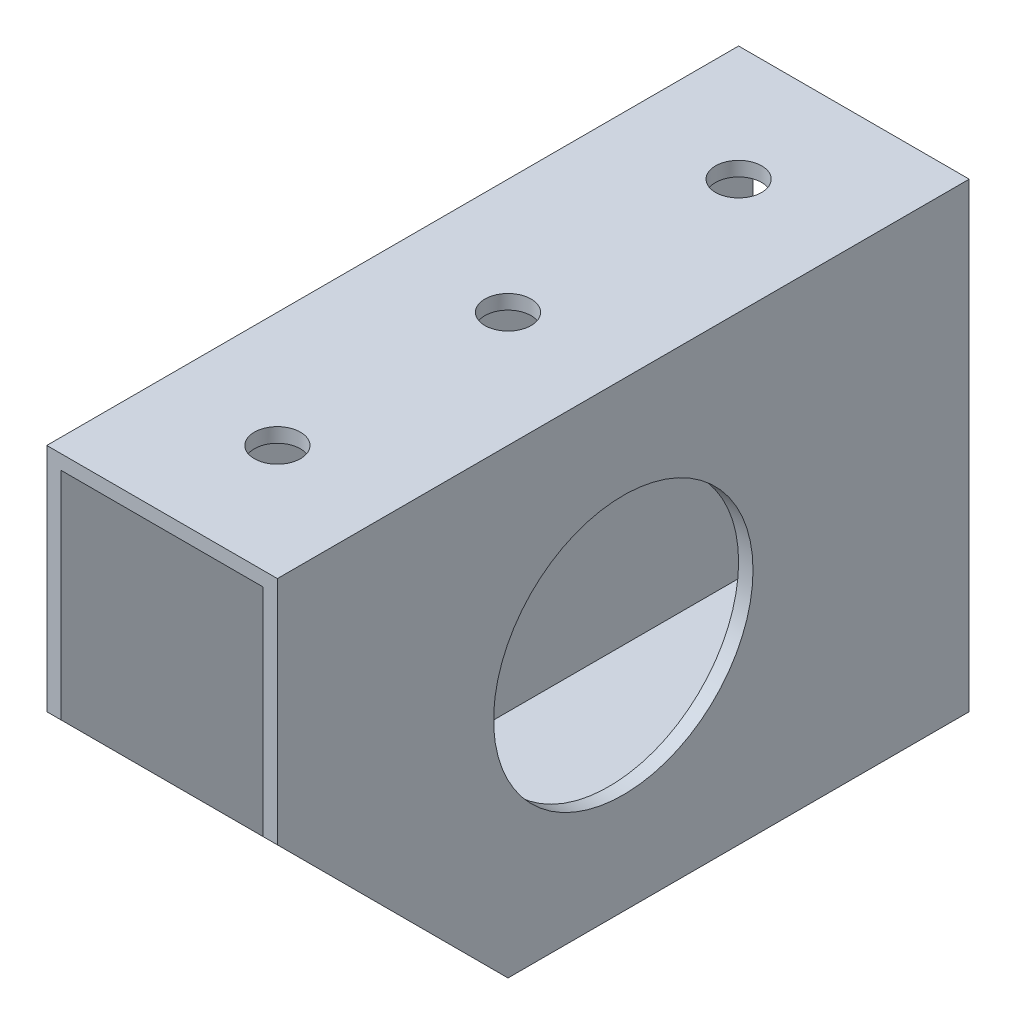
ISO-10303-21;
HEADER;
FILE_DESCRIPTION(('STEP AP214'),'2;1');
FILE_NAME('part.step','',(''),(''),'','','');
FILE_SCHEMA(('AUTOMOTIVE_DESIGN { 1 0 10303 214 1 1 1 1 }'));
ENDSEC;
DATA;
#1=APPLICATION_CONTEXT('core data for automotive mechanical design processes');
#2=APPLICATION_PROTOCOL_DEFINITION('international standard','automotive_design',2000,#1);
#3=PRODUCT_CONTEXT('',#1,'mechanical');
#4=PRODUCT('Part','Part','',(#3));
#5=PRODUCT_RELATED_PRODUCT_CATEGORY('part','',(#4));
#6=PRODUCT_DEFINITION_FORMATION('','',#4);
#7=PRODUCT_DEFINITION_CONTEXT('part definition',#1,'design');
#8=PRODUCT_DEFINITION('design','',#6,#7);
#9=PRODUCT_DEFINITION_SHAPE('','',#8);
#10=(LENGTH_UNIT() NAMED_UNIT(*) SI_UNIT(.MILLI.,.METRE.));
#11=(NAMED_UNIT(*) PLANE_ANGLE_UNIT() SI_UNIT($,.RADIAN.));
#12=(NAMED_UNIT(*) SI_UNIT($,.STERADIAN.) SOLID_ANGLE_UNIT());
#13=UNCERTAINTY_MEASURE_WITH_UNIT(LENGTH_MEASURE(1.E-05),#10,'distance_accuracy_value','');
#14=(GEOMETRIC_REPRESENTATION_CONTEXT(3) GLOBAL_UNCERTAINTY_ASSIGNED_CONTEXT((#13)) GLOBAL_UNIT_ASSIGNED_CONTEXT((#10,
#11,#12)) REPRESENTATION_CONTEXT('',''));
#15=CARTESIAN_POINT('',(0.,0.,0.));
#16=DIRECTION('',(0.,0.,1.));
#17=DIRECTION('',(1.,0.,0.));
#18=AXIS2_PLACEMENT_3D('',#15,#16,#17);
#19=CARTESIAN_POINT('',(0.,0.,76.2));
#20=DIRECTION('',(0.,0.,-1.));
#21=DIRECTION('',(-1.,0.,0.));
#22=AXIS2_PLACEMENT_3D('',#19,#20,#21);
#23=PLANE('',#22);
#24=DIRECTION('',(0.,-1.,0.));
#25=VECTOR('',#24,1.);
#26=CARTESIAN_POINT('',(0.,0.,76.2));
#27=LINE('',#26,#25);
#28=CARTESIAN_POINT('',(0.,50.8,76.2));
#29=VERTEX_POINT('',#28);
#30=CARTESIAN_POINT('',(0.,25.4,76.2));
#31=VERTEX_POINT('',#30);
#32=EDGE_CURVE('E207',#29,#31,#27,.T.);
#33=ORIENTED_EDGE('',*,*,#32,.T.);
#34=DIRECTION('',(1.,0.,0.));
#35=VECTOR('',#34,1.);
#36=CARTESIAN_POINT('',(0.,25.4,76.2));
#37=LINE('',#36,#35);
#38=CARTESIAN_POINT('',(1.5875,25.4,76.2));
#39=VERTEX_POINT('',#38);
#40=EDGE_CURVE('E120',#31,#39,#37,.T.);
#41=ORIENTED_EDGE('',*,*,#40,.T.);
#42=DIRECTION('',(0.,-1.,0.));
#43=VECTOR('',#42,1.);
#44=CARTESIAN_POINT('',(1.5875,1.5875,76.2));
#45=LINE('',#44,#43);
#46=CARTESIAN_POINT('',(1.5875,49.2125,76.2));
#47=VERTEX_POINT('',#46);
#48=EDGE_CURVE('E170',#47,#39,#45,.T.);
#49=ORIENTED_EDGE('',*,*,#48,.F.);
#50=DIRECTION('',(-1.,0.,0.));
#51=VECTOR('',#50,1.);
#52=CARTESIAN_POINT('',(1.5875,49.2125,76.2));
#53=LINE('',#52,#51);
#54=CARTESIAN_POINT('',(23.8125,49.2125,76.2));
#55=VERTEX_POINT('',#54);
#56=EDGE_CURVE('E177',#55,#47,#53,.T.);
#57=ORIENTED_EDGE('',*,*,#56,.F.);
#58=DIRECTION('',(0.,1.,0.));
#59=VECTOR('',#58,1.);
#60=CARTESIAN_POINT('',(23.8125,1.5875,76.2));
#61=LINE('',#60,#59);
#62=CARTESIAN_POINT('',(23.8125,25.4,76.2));
#63=VERTEX_POINT('',#62);
#64=EDGE_CURVE('E61',#63,#55,#61,.T.);
#65=ORIENTED_EDGE('',*,*,#64,.F.);
#66=CARTESIAN_POINT('',(25.4,25.4,76.2));
#67=VERTEX_POINT('',#66);
#68=EDGE_CURVE('E54',#63,#67,#37,.T.);
#69=ORIENTED_EDGE('',*,*,#68,.T.);
#70=DIRECTION('',(0.,1.,0.));
#71=VECTOR('',#70,1.);
#72=CARTESIAN_POINT('',(25.4,0.,76.2));
#73=LINE('',#72,#71);
#74=CARTESIAN_POINT('',(25.4,50.8,76.2));
#75=VERTEX_POINT('',#74);
#76=EDGE_CURVE('E210',#67,#75,#73,.T.);
#77=ORIENTED_EDGE('',*,*,#76,.T.);
#78=DIRECTION('',(-1.,0.,0.));
#79=VECTOR('',#78,1.);
#80=CARTESIAN_POINT('',(0.,50.8,76.2));
#81=LINE('',#80,#79);
#82=EDGE_CURVE('E214',#75,#29,#81,.T.);
#83=ORIENTED_EDGE('',*,*,#82,.T.);
#84=EDGE_LOOP('',(#33,#41,#49,#57,#65,#69,#77,#83));
#85=FACE_BOUND('',#84,.T.);
#86=ADVANCED_FACE('F39',(#85),#23,.F.);
#87=CARTESIAN_POINT('',(0.,0.,0.));
#88=DIRECTION('',(0.,0.,-1.));
#89=DIRECTION('',(-1.,0.,0.));
#90=AXIS2_PLACEMENT_3D('',#87,#88,#89);
#91=PLANE('',#90);
#92=DIRECTION('',(0.,-1.,0.));
#93=VECTOR('',#92,1.);
#94=CARTESIAN_POINT('',(0.,0.,0.));
#95=LINE('',#94,#93);
#96=CARTESIAN_POINT('',(0.,50.8,0.));
#97=VERTEX_POINT('',#96);
#98=CARTESIAN_POINT('',(0.,0.,0.));
#99=VERTEX_POINT('',#98);
#100=EDGE_CURVE('E139',#97,#99,#95,.T.);
#101=ORIENTED_EDGE('',*,*,#100,.F.);
#102=DIRECTION('',(-1.,0.,0.));
#103=VECTOR('',#102,1.);
#104=CARTESIAN_POINT('',(0.,50.8,0.));
#105=LINE('',#104,#103);
#106=CARTESIAN_POINT('',(25.4,50.8,0.));
#107=VERTEX_POINT('',#106);
#108=EDGE_CURVE('E211',#107,#97,#105,.T.);
#109=ORIENTED_EDGE('',*,*,#108,.F.);
#110=DIRECTION('',(0.,1.,0.));
#111=VECTOR('',#110,1.);
#112=CARTESIAN_POINT('',(25.4,0.,0.));
#113=LINE('',#112,#111);
#114=CARTESIAN_POINT('',(25.4,0.,0.));
#115=VERTEX_POINT('',#114);
#116=EDGE_CURVE('E223',#115,#107,#113,.T.);
#117=ORIENTED_EDGE('',*,*,#116,.F.);
#118=DIRECTION('',(1.,0.,0.));
#119=VECTOR('',#118,1.);
#120=CARTESIAN_POINT('',(0.,0.,0.));
#121=LINE('',#120,#119);
#122=EDGE_CURVE('E220',#99,#115,#121,.T.);
#123=ORIENTED_EDGE('',*,*,#122,.F.);
#124=EDGE_LOOP('',(#101,#109,#117,#123));
#125=FACE_BOUND('',#124,.T.);
#126=DIRECTION('',(-1.,0.,0.));
#127=VECTOR('',#126,1.);
#128=CARTESIAN_POINT('',(1.5875,49.2125,0.));
#129=LINE('',#128,#127);
#130=CARTESIAN_POINT('',(23.8125,49.2125,0.));
#131=VERTEX_POINT('',#130);
#132=CARTESIAN_POINT('',(1.5875,49.2125,0.));
#133=VERTEX_POINT('',#132);
#134=EDGE_CURVE('E174',#131,#133,#129,.T.);
#135=ORIENTED_EDGE('',*,*,#134,.T.);
#136=DIRECTION('',(0.,-1.,0.));
#137=VECTOR('',#136,1.);
#138=CARTESIAN_POINT('',(1.5875,1.5875,0.));
#139=LINE('',#138,#137);
#140=CARTESIAN_POINT('',(1.5875,1.5875,0.));
#141=VERTEX_POINT('',#140);
#142=EDGE_CURVE('E156',#133,#141,#139,.T.);
#143=ORIENTED_EDGE('',*,*,#142,.T.);
#144=DIRECTION('',(1.,0.,0.));
#145=VECTOR('',#144,1.);
#146=CARTESIAN_POINT('',(1.5875,1.5875,0.));
#147=LINE('',#146,#145);
#148=CARTESIAN_POINT('',(23.8125,1.5875,0.));
#149=VERTEX_POINT('',#148);
#150=EDGE_CURVE('E184',#141,#149,#147,.T.);
#151=ORIENTED_EDGE('',*,*,#150,.T.);
#152=DIRECTION('',(0.,1.,0.));
#153=VECTOR('',#152,1.);
#154=CARTESIAN_POINT('',(23.8125,1.5875,0.));
#155=LINE('',#154,#153);
#156=EDGE_CURVE('E188',#149,#131,#155,.T.);
#157=ORIENTED_EDGE('',*,*,#156,.T.);
#158=EDGE_LOOP('',(#135,#143,#151,#157));
#159=FACE_BOUND('',#158,.T.);
#160=ADVANCED_FACE('F241',(#125,#159),#91,.T.);
#161=CARTESIAN_POINT('',(0.,0.,76.2));
#162=DIRECTION('',(1.,0.,0.));
#163=DIRECTION('',(0.,0.,-1.));
#164=AXIS2_PLACEMENT_3D('',#161,#162,#163);
#165=PLANE('',#164);
#166=CARTESIAN_POINT('',(0.,25.4,38.1));
#167=DIRECTION('',(1.,0.,0.));
#168=DIRECTION('',(0.,0.,-1.));
#169=AXIS2_PLACEMENT_3D('',#166,#167,#168);
#170=CIRCLE('',#169,14.2875);
#171=CARTESIAN_POINT('',(0.,25.4,23.8125));
#172=VERTEX_POINT('',#171);
#173=EDGE_CURVE('E150',#172,#172,#170,.T.);
#174=ORIENTED_EDGE('',*,*,#173,.T.);
#175=EDGE_LOOP('',(#174));
#176=FACE_BOUND('',#175,.T.);
#177=DIRECTION('',(0.,0.,-1.));
#178=VECTOR('',#177,1.);
#179=CARTESIAN_POINT('',(0.,0.,76.2));
#180=LINE('',#179,#178);
#181=CARTESIAN_POINT('',(0.,0.,50.8));
#182=VERTEX_POINT('',#181);
#183=EDGE_CURVE('E48',#182,#99,#180,.T.);
#184=ORIENTED_EDGE('',*,*,#183,.F.);
#185=DIRECTION('',(0.,0.707106781186547,0.707106781186547));
#186=VECTOR('',#185,1.);
#187=CARTESIAN_POINT('',(0.,0.,50.8));
#188=LINE('',#187,#186);
#189=EDGE_CURVE('E114',#182,#31,#188,.T.);
#190=ORIENTED_EDGE('',*,*,#189,.T.);
#191=ORIENTED_EDGE('',*,*,#32,.F.);
#192=DIRECTION('',(0.,0.,-1.));
#193=VECTOR('',#192,1.);
#194=CARTESIAN_POINT('',(0.,50.8,76.2));
#195=LINE('',#194,#193);
#196=EDGE_CURVE('E217',#29,#97,#195,.T.);
#197=ORIENTED_EDGE('',*,*,#196,.T.);
#198=ORIENTED_EDGE('',*,*,#100,.T.);
#199=EDGE_LOOP('',(#184,#190,#191,#197,#198));
#200=FACE_BOUND('',#199,.T.);
#201=ADVANCED_FACE('F41',(#176,#200),#165,.F.);
#202=CARTESIAN_POINT('',(0.,0.,76.2));
#203=DIRECTION('',(0.,1.,0.));
#204=DIRECTION('',(0.,0.,1.));
#205=AXIS2_PLACEMENT_3D('',#202,#203,#204);
#206=PLANE('',#205);
#207=CARTESIAN_POINT('',(12.7,0.,12.7));
#208=DIRECTION('',(0.,-1.,0.));
#209=DIRECTION('',(0.,0.,-1.));
#210=AXIS2_PLACEMENT_3D('',#207,#208,#209);
#211=CIRCLE('',#210,2.54);
#212=CARTESIAN_POINT('',(12.7,0.,10.16));
#213=VERTEX_POINT('',#212);
#214=EDGE_CURVE('E309',#213,#213,#211,.T.);
#215=ORIENTED_EDGE('',*,*,#214,.F.);
#216=EDGE_LOOP('',(#215));
#217=FACE_BOUND('',#216,.T.);
#218=CARTESIAN_POINT('',(12.7,0.,39.6875));
#219=DIRECTION('',(0.,-1.,0.));
#220=DIRECTION('',(0.,0.,-1.));
#221=AXIS2_PLACEMENT_3D('',#218,#219,#220);
#222=CIRCLE('',#221,2.54);
#223=CARTESIAN_POINT('',(12.7,0.,37.1475));
#224=VERTEX_POINT('',#223);
#225=EDGE_CURVE('E312',#224,#224,#222,.T.);
#226=ORIENTED_EDGE('',*,*,#225,.F.);
#227=EDGE_LOOP('',(#226));
#228=FACE_BOUND('',#227,.T.);
#229=DIRECTION('',(0.,0.,-1.));
#230=VECTOR('',#229,1.);
#231=CARTESIAN_POINT('',(25.4,0.,76.2));
#232=LINE('',#231,#230);
#233=CARTESIAN_POINT('',(25.4,0.,50.8));
#234=VERTEX_POINT('',#233);
#235=EDGE_CURVE('E133',#234,#115,#232,.T.);
#236=ORIENTED_EDGE('',*,*,#235,.F.);
#237=DIRECTION('',(1.,0.,0.));
#238=VECTOR('',#237,1.);
#239=CARTESIAN_POINT('',(0.,0.,50.8));
#240=LINE('',#239,#238);
#241=EDGE_CURVE('E117',#182,#234,#240,.T.);
#242=ORIENTED_EDGE('',*,*,#241,.F.);
#243=ORIENTED_EDGE('',*,*,#183,.T.);
#244=ORIENTED_EDGE('',*,*,#122,.T.);
#245=EDGE_LOOP('',(#236,#242,#243,#244));
#246=FACE_BOUND('',#245,.T.);
#247=ADVANCED_FACE('F130',(#217,#228,#246),#206,.F.);
#248=CARTESIAN_POINT('',(25.4,0.,76.2));
#249=DIRECTION('',(-1.,0.,0.));
#250=DIRECTION('',(0.,0.,1.));
#251=AXIS2_PLACEMENT_3D('',#248,#249,#250);
#252=PLANE('',#251);
#253=CARTESIAN_POINT('',(25.4,25.4,38.1));
#254=DIRECTION('',(1.,0.,0.));
#255=DIRECTION('',(0.,0.,-1.));
#256=AXIS2_PLACEMENT_3D('',#253,#254,#255);
#257=CIRCLE('',#256,14.2875);
#258=CARTESIAN_POINT('',(25.4,25.4,23.8125));
#259=VERTEX_POINT('',#258);
#260=EDGE_CURVE('E159',#259,#259,#257,.T.);
#261=ORIENTED_EDGE('',*,*,#260,.F.);
#262=EDGE_LOOP('',(#261));
#263=FACE_BOUND('',#262,.T.);
#264=ORIENTED_EDGE('',*,*,#76,.F.);
#265=DIRECTION('',(0.,0.707106781186547,0.707106781186547));
#266=VECTOR('',#265,1.);
#267=CARTESIAN_POINT('',(25.4,0.,50.8));
#268=LINE('',#267,#266);
#269=EDGE_CURVE('E126',#234,#67,#268,.T.);
#270=ORIENTED_EDGE('',*,*,#269,.F.);
#271=ORIENTED_EDGE('',*,*,#235,.T.);
#272=ORIENTED_EDGE('',*,*,#116,.T.);
#273=DIRECTION('',(0.,0.,-1.));
#274=VECTOR('',#273,1.);
#275=CARTESIAN_POINT('',(25.4,50.8,76.2));
#276=LINE('',#275,#274);
#277=EDGE_CURVE('E143',#75,#107,#276,.T.);
#278=ORIENTED_EDGE('',*,*,#277,.F.);
#279=EDGE_LOOP('',(#264,#270,#271,#272,#278));
#280=FACE_BOUND('',#279,.T.);
#281=ADVANCED_FACE('F243',(#263,#280),#252,.F.);
#282=CARTESIAN_POINT('',(0.,50.8,76.2));
#283=DIRECTION('',(0.,-1.,0.));
#284=DIRECTION('',(0.,0.,-1.));
#285=AXIS2_PLACEMENT_3D('',#282,#283,#284);
#286=PLANE('',#285);
#287=CARTESIAN_POINT('',(12.7,50.8,12.7));
#288=DIRECTION('',(0.,1.,0.));
#289=DIRECTION('',(0.,0.,1.));
#290=AXIS2_PLACEMENT_3D('',#287,#288,#289);
#291=CIRCLE('',#290,2.54);
#292=CARTESIAN_POINT('',(12.7,50.8,15.24));
#293=VERTEX_POINT('',#292);
#294=EDGE_CURVE('E245',#293,#293,#291,.T.);
#295=ORIENTED_EDGE('',*,*,#294,.F.);
#296=EDGE_LOOP('',(#295));
#297=FACE_BOUND('',#296,.T.);
#298=CARTESIAN_POINT('',(12.7,50.8,38.1));
#299=DIRECTION('',(0.,1.,0.));
#300=DIRECTION('',(0.,0.,1.));
#301=AXIS2_PLACEMENT_3D('',#298,#299,#300);
#302=CIRCLE('',#301,2.54);
#303=CARTESIAN_POINT('',(12.7,50.8,40.64));
#304=VERTEX_POINT('',#303);
#305=EDGE_CURVE('E327',#304,#304,#302,.T.);
#306=ORIENTED_EDGE('',*,*,#305,.F.);
#307=EDGE_LOOP('',(#306));
#308=FACE_BOUND('',#307,.T.);
#309=CARTESIAN_POINT('',(12.7,50.8,63.5));
#310=DIRECTION('',(0.,1.,0.));
#311=DIRECTION('',(0.,0.,1.));
#312=AXIS2_PLACEMENT_3D('',#309,#310,#311);
#313=CIRCLE('',#312,2.54);
#314=CARTESIAN_POINT('',(12.7,50.8,66.04));
#315=VERTEX_POINT('',#314);
#316=EDGE_CURVE('E335',#315,#315,#313,.T.);
#317=ORIENTED_EDGE('',*,*,#316,.F.);
#318=EDGE_LOOP('',(#317));
#319=FACE_BOUND('',#318,.T.);
#320=ORIENTED_EDGE('',*,*,#108,.T.);
#321=ORIENTED_EDGE('',*,*,#196,.F.);
#322=ORIENTED_EDGE('',*,*,#82,.F.);
#323=ORIENTED_EDGE('',*,*,#277,.T.);
#324=EDGE_LOOP('',(#320,#321,#322,#323));
#325=FACE_BOUND('',#324,.T.);
#326=ADVANCED_FACE('F235',(#297,#308,#319,#325),#286,.F.);
#327=CARTESIAN_POINT('',(1.5875,1.5875,76.2));
#328=DIRECTION('',(1.,0.,0.));
#329=DIRECTION('',(0.,0.,-1.));
#330=AXIS2_PLACEMENT_3D('',#327,#328,#329);
#331=PLANE('',#330);
#332=DIRECTION('',(0.,0.707106781186548,0.707106781186548));
#333=VECTOR('',#332,1.);
#334=CARTESIAN_POINT('',(1.5875,13.49375,64.29375));
#335=LINE('',#334,#333);
#336=CARTESIAN_POINT('',(1.5875,1.5875,52.3875));
#337=VERTEX_POINT('',#336);
#338=EDGE_CURVE('E165',#337,#39,#335,.T.);
#339=ORIENTED_EDGE('',*,*,#338,.F.);
#340=DIRECTION('',(0.,0.,-1.));
#341=VECTOR('',#340,1.);
#342=CARTESIAN_POINT('',(1.5875,1.5875,76.2));
#343=LINE('',#342,#341);
#344=EDGE_CURVE('E204',#337,#141,#343,.T.);
#345=ORIENTED_EDGE('',*,*,#344,.T.);
#346=ORIENTED_EDGE('',*,*,#142,.F.);
#347=DIRECTION('',(0.,0.,-1.));
#348=VECTOR('',#347,1.);
#349=CARTESIAN_POINT('',(1.5875,49.2125,76.2));
#350=LINE('',#349,#348);
#351=EDGE_CURVE('E180',#47,#133,#350,.T.);
#352=ORIENTED_EDGE('',*,*,#351,.F.);
#353=ORIENTED_EDGE('',*,*,#48,.T.);
#354=EDGE_LOOP('',(#339,#345,#346,#352,#353));
#355=FACE_BOUND('',#354,.T.);
#356=CARTESIAN_POINT('',(1.5875,25.4,38.1));
#357=DIRECTION('',(1.,0.,0.));
#358=DIRECTION('',(0.,0.,-1.));
#359=AXIS2_PLACEMENT_3D('',#356,#357,#358);
#360=CIRCLE('',#359,14.2875);
#361=CARTESIAN_POINT('',(1.5875,25.4,23.8125));
#362=VERTEX_POINT('',#361);
#363=EDGE_CURVE('E149',#362,#362,#360,.T.);
#364=ORIENTED_EDGE('',*,*,#363,.F.);
#365=EDGE_LOOP('',(#364));
#366=FACE_BOUND('',#365,.T.);
#367=ADVANCED_FACE('F265',(#355,#366),#331,.T.);
#368=CARTESIAN_POINT('',(1.5875,1.5875,76.2));
#369=DIRECTION('',(0.,1.,0.));
#370=DIRECTION('',(0.,0.,1.));
#371=AXIS2_PLACEMENT_3D('',#368,#369,#370);
#372=PLANE('',#371);
#373=CARTESIAN_POINT('',(12.7,1.5875,12.7));
#374=DIRECTION('',(0.,1.,0.));
#375=DIRECTION('',(0.,0.,1.));
#376=AXIS2_PLACEMENT_3D('',#373,#374,#375);
#377=CIRCLE('',#376,2.54);
#378=CARTESIAN_POINT('',(12.7,1.5875,15.24));
#379=VERTEX_POINT('',#378);
#380=EDGE_CURVE('E315',#379,#379,#377,.F.);
#381=ORIENTED_EDGE('',*,*,#380,.T.);
#382=EDGE_LOOP('',(#381));
#383=FACE_BOUND('',#382,.T.);
#384=CARTESIAN_POINT('',(12.7,1.5875,39.6875));
#385=DIRECTION('',(0.,1.,0.));
#386=DIRECTION('',(0.,0.,1.));
#387=AXIS2_PLACEMENT_3D('',#384,#385,#386);
#388=CIRCLE('',#387,2.54);
#389=CARTESIAN_POINT('',(12.7,1.5875,42.2275));
#390=VERTEX_POINT('',#389);
#391=EDGE_CURVE('E316',#390,#390,#388,.F.);
#392=ORIENTED_EDGE('',*,*,#391,.T.);
#393=EDGE_LOOP('',(#392));
#394=FACE_BOUND('',#393,.T.);
#395=DIRECTION('',(-1.,0.,0.));
#396=VECTOR('',#395,1.);
#397=CARTESIAN_POINT('',(1.5875,1.5875,52.3875));
#398=LINE('',#397,#396);
#399=CARTESIAN_POINT('',(23.8125,1.5875,52.3875));
#400=VERTEX_POINT('',#399);
#401=EDGE_CURVE('E254',#400,#337,#398,.T.);
#402=ORIENTED_EDGE('',*,*,#401,.F.);
#403=DIRECTION('',(0.,0.,-1.));
#404=VECTOR('',#403,1.);
#405=CARTESIAN_POINT('',(23.8125,1.5875,76.2));
#406=LINE('',#405,#404);
#407=EDGE_CURVE('E201',#400,#149,#406,.T.);
#408=ORIENTED_EDGE('',*,*,#407,.T.);
#409=ORIENTED_EDGE('',*,*,#150,.F.);
#410=ORIENTED_EDGE('',*,*,#344,.F.);
#411=EDGE_LOOP('',(#402,#408,#409,#410));
#412=FACE_BOUND('',#411,.T.);
#413=ADVANCED_FACE('F277',(#383,#394,#412),#372,.T.);
#414=CARTESIAN_POINT('',(23.8125,1.5875,76.2));
#415=DIRECTION('',(-1.,0.,0.));
#416=DIRECTION('',(0.,0.,1.));
#417=AXIS2_PLACEMENT_3D('',#414,#415,#416);
#418=PLANE('',#417);
#419=DIRECTION('',(0.,-0.707106781186548,-0.707106781186548));
#420=VECTOR('',#419,1.);
#421=CARTESIAN_POINT('',(23.8125,13.49375,64.29375));
#422=LINE('',#421,#420);
#423=EDGE_CURVE('E11',#63,#400,#422,.T.);
#424=ORIENTED_EDGE('',*,*,#423,.F.);
#425=ORIENTED_EDGE('',*,*,#64,.T.);
#426=DIRECTION('',(0.,0.,-1.));
#427=VECTOR('',#426,1.);
#428=CARTESIAN_POINT('',(23.8125,49.2125,76.2));
#429=LINE('',#428,#427);
#430=EDGE_CURVE('E198',#55,#131,#429,.T.);
#431=ORIENTED_EDGE('',*,*,#430,.T.);
#432=ORIENTED_EDGE('',*,*,#156,.F.);
#433=ORIENTED_EDGE('',*,*,#407,.F.);
#434=EDGE_LOOP('',(#424,#425,#431,#432,#433));
#435=FACE_BOUND('',#434,.T.);
#436=CARTESIAN_POINT('',(23.8125,25.4,38.1));
#437=DIRECTION('',(-1.,0.,0.));
#438=DIRECTION('',(0.,0.,1.));
#439=AXIS2_PLACEMENT_3D('',#436,#437,#438);
#440=CIRCLE('',#439,14.2875);
#441=CARTESIAN_POINT('',(23.8125,25.4,52.3875));
#442=VERTEX_POINT('',#441);
#443=EDGE_CURVE('E146',#442,#442,#440,.T.);
#444=ORIENTED_EDGE('',*,*,#443,.F.);
#445=EDGE_LOOP('',(#444));
#446=FACE_BOUND('',#445,.T.);
#447=ADVANCED_FACE('F273',(#435,#446),#418,.T.);
#448=CARTESIAN_POINT('',(1.5875,49.2125,76.2));
#449=DIRECTION('',(0.,-1.,0.));
#450=DIRECTION('',(0.,0.,-1.));
#451=AXIS2_PLACEMENT_3D('',#448,#449,#450);
#452=PLANE('',#451);
#453=CARTESIAN_POINT('',(12.7,49.2125,12.7));
#454=DIRECTION('',(0.,-1.,0.));
#455=DIRECTION('',(0.,0.,-1.));
#456=AXIS2_PLACEMENT_3D('',#453,#454,#455);
#457=CIRCLE('',#456,2.54);
#458=CARTESIAN_POINT('',(12.7,49.2125,10.16));
#459=VERTEX_POINT('',#458);
#460=EDGE_CURVE('E249',#459,#459,#457,.F.);
#461=ORIENTED_EDGE('',*,*,#460,.T.);
#462=EDGE_LOOP('',(#461));
#463=FACE_BOUND('',#462,.T.);
#464=CARTESIAN_POINT('',(12.7,49.2125,38.1));
#465=DIRECTION('',(0.,-1.,0.));
#466=DIRECTION('',(0.,0.,-1.));
#467=AXIS2_PLACEMENT_3D('',#464,#465,#466);
#468=CIRCLE('',#467,2.54);
#469=CARTESIAN_POINT('',(12.7,49.2125,35.56));
#470=VERTEX_POINT('',#469);
#471=EDGE_CURVE('E331',#470,#470,#468,.F.);
#472=ORIENTED_EDGE('',*,*,#471,.T.);
#473=EDGE_LOOP('',(#472));
#474=FACE_BOUND('',#473,.T.);
#475=CARTESIAN_POINT('',(12.7,49.2125,63.5));
#476=DIRECTION('',(0.,-1.,0.));
#477=DIRECTION('',(0.,0.,-1.));
#478=AXIS2_PLACEMENT_3D('',#475,#476,#477);
#479=CIRCLE('',#478,2.54);
#480=CARTESIAN_POINT('',(12.7,49.2125,60.96));
#481=VERTEX_POINT('',#480);
#482=EDGE_CURVE('E338',#481,#481,#479,.F.);
#483=ORIENTED_EDGE('',*,*,#482,.T.);
#484=EDGE_LOOP('',(#483));
#485=FACE_BOUND('',#484,.T.);
#486=ORIENTED_EDGE('',*,*,#134,.F.);
#487=ORIENTED_EDGE('',*,*,#430,.F.);
#488=ORIENTED_EDGE('',*,*,#56,.T.);
#489=ORIENTED_EDGE('',*,*,#351,.T.);
#490=EDGE_LOOP('',(#486,#487,#488,#489));
#491=FACE_BOUND('',#490,.T.);
#492=ADVANCED_FACE('F269',(#463,#474,#485,#491),#452,.T.);
#493=CARTESIAN_POINT('',(0.,25.4,38.1));
#494=DIRECTION('',(1.,0.,0.));
#495=DIRECTION('',(0.,0.,-1.));
#496=AXIS2_PLACEMENT_3D('',#493,#494,#495);
#497=CYLINDRICAL_SURFACE('',#496,14.2875);
#498=ORIENTED_EDGE('',*,*,#443,.T.);
#499=EDGE_LOOP('',(#498));
#500=FACE_BOUND('',#499,.T.);
#501=ORIENTED_EDGE('',*,*,#260,.T.);
#502=EDGE_LOOP('',(#501));
#503=FACE_BOUND('',#502,.T.);
#504=ADVANCED_FACE('F373',(#500,#503),#497,.F.);
#505=ORIENTED_EDGE('',*,*,#363,.T.);
#506=EDGE_LOOP('',(#505));
#507=FACE_BOUND('',#506,.T.);
#508=ORIENTED_EDGE('',*,*,#173,.F.);
#509=EDGE_LOOP('',(#508));
#510=FACE_BOUND('',#509,.T.);
#511=ADVANCED_FACE('F372',(#507,#510),#497,.F.);
#512=CARTESIAN_POINT('',(0.,0.,50.8));
#513=DIRECTION('',(0.,0.707106781186548,-0.707106781186548));
#514=DIRECTION('',(0.,0.707106781186548,0.707106781186548));
#515=AXIS2_PLACEMENT_3D('',#512,#513,#514);
#516=PLANE('',#515);
#517=ORIENTED_EDGE('',*,*,#338,.T.);
#518=ORIENTED_EDGE('',*,*,#40,.F.);
#519=ORIENTED_EDGE('',*,*,#189,.F.);
#520=ORIENTED_EDGE('',*,*,#241,.T.);
#521=ORIENTED_EDGE('',*,*,#269,.T.);
#522=ORIENTED_EDGE('',*,*,#68,.F.);
#523=ORIENTED_EDGE('',*,*,#423,.T.);
#524=ORIENTED_EDGE('',*,*,#401,.T.);
#525=EDGE_LOOP('',(#517,#518,#519,#520,#521,#522,#523,#524));
#526=FACE_BOUND('',#525,.T.);
#527=ADVANCED_FACE('F116',(#526),#516,.F.);
#528=CARTESIAN_POINT('',(12.7,-0.001000000000001,63.5));
#529=DIRECTION('',(0.,1.,0.));
#530=DIRECTION('',(0.,0.,1.));
#531=AXIS2_PLACEMENT_3D('',#528,#529,#530);
#532=CYLINDRICAL_SURFACE('',#531,2.54);
#533=ORIENTED_EDGE('',*,*,#482,.F.);
#534=EDGE_LOOP('',(#533));
#535=FACE_BOUND('',#534,.T.);
#536=ORIENTED_EDGE('',*,*,#316,.T.);
#537=EDGE_LOOP('',(#536));
#538=FACE_BOUND('',#537,.T.);
#539=ADVANCED_FACE('F365',(#535,#538),#532,.F.);
#540=CARTESIAN_POINT('',(12.7,-0.001000000000001,38.1));
#541=DIRECTION('',(0.,1.,0.));
#542=DIRECTION('',(0.,0.,1.));
#543=AXIS2_PLACEMENT_3D('',#540,#541,#542);
#544=CYLINDRICAL_SURFACE('',#543,2.54);
#545=ORIENTED_EDGE('',*,*,#471,.F.);
#546=EDGE_LOOP('',(#545));
#547=FACE_BOUND('',#546,.T.);
#548=ORIENTED_EDGE('',*,*,#305,.T.);
#549=EDGE_LOOP('',(#548));
#550=FACE_BOUND('',#549,.T.);
#551=ADVANCED_FACE('F361',(#547,#550),#544,.F.);
#552=CARTESIAN_POINT('',(12.7,-0.001000000000001,12.7));
#553=DIRECTION('',(0.,1.,0.));
#554=DIRECTION('',(0.,0.,1.));
#555=AXIS2_PLACEMENT_3D('',#552,#553,#554);
#556=CYLINDRICAL_SURFACE('',#555,2.54);
#557=ORIENTED_EDGE('',*,*,#460,.F.);
#558=EDGE_LOOP('',(#557));
#559=FACE_BOUND('',#558,.T.);
#560=ORIENTED_EDGE('',*,*,#294,.T.);
#561=EDGE_LOOP('',(#560));
#562=FACE_BOUND('',#561,.T.);
#563=ADVANCED_FACE('F354',(#559,#562),#556,.F.);
#564=CARTESIAN_POINT('',(12.7,50.801,39.6875));
#565=DIRECTION('',(0.,-1.,0.));
#566=DIRECTION('',(0.,0.,-1.));
#567=AXIS2_PLACEMENT_3D('',#564,#565,#566);
#568=CYLINDRICAL_SURFACE('',#567,2.54);
#569=ORIENTED_EDGE('',*,*,#391,.F.);
#570=EDGE_LOOP('',(#569));
#571=FACE_BOUND('',#570,.T.);
#572=ORIENTED_EDGE('',*,*,#225,.T.);
#573=EDGE_LOOP('',(#572));
#574=FACE_BOUND('',#573,.T.);
#575=ADVANCED_FACE('F348',(#571,#574),#568,.F.);
#576=CARTESIAN_POINT('',(12.7,50.801,12.7));
#577=DIRECTION('',(0.,-1.,0.));
#578=DIRECTION('',(0.,0.,-1.));
#579=AXIS2_PLACEMENT_3D('',#576,#577,#578);
#580=CYLINDRICAL_SURFACE('',#579,2.54);
#581=ORIENTED_EDGE('',*,*,#380,.F.);
#582=EDGE_LOOP('',(#581));
#583=FACE_BOUND('',#582,.T.);
#584=ORIENTED_EDGE('',*,*,#214,.T.);
#585=EDGE_LOOP('',(#584));
#586=FACE_BOUND('',#585,.T.);
#587=ADVANCED_FACE('F346',(#583,#586),#580,.F.);
#588=CLOSED_SHELL('',(#86,#160,#201,#247,#281,#326,#367,#413,#447,#492,#504,#511,#527,#539,#551,
#563,#575,#587));
#589=MANIFOLD_SOLID_BREP('B2',#588);
#590=ADVANCED_BREP_SHAPE_REPRESENTATION('',(#18,#589),#14);
#591=SHAPE_DEFINITION_REPRESENTATION(#9,#590);
ENDSEC;
END-ISO-10303-21;
